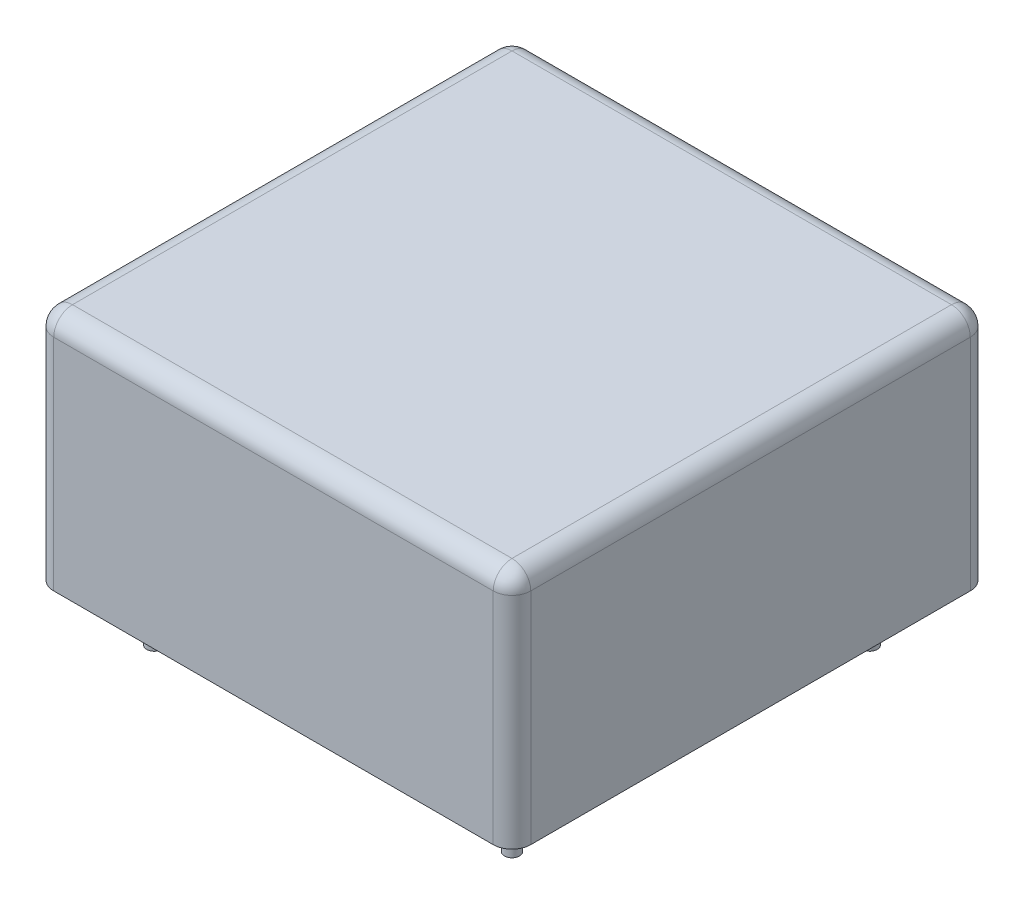
ISO-10303-21;
HEADER;
FILE_DESCRIPTION(('STEP AP214'),'2;1');
FILE_NAME('part.step','',(''),(''),'','','');
FILE_SCHEMA(('AUTOMOTIVE_DESIGN { 1 0 10303 214 1 1 1 1 }'));
ENDSEC;
DATA;
#1=APPLICATION_CONTEXT('core data for automotive mechanical design processes');
#2=APPLICATION_PROTOCOL_DEFINITION('international standard','automotive_design',2000,#1);
#3=PRODUCT_CONTEXT('',#1,'mechanical');
#4=PRODUCT('Part','Part','',(#3));
#5=PRODUCT_RELATED_PRODUCT_CATEGORY('part','',(#4));
#6=PRODUCT_DEFINITION_FORMATION('','',#4);
#7=PRODUCT_DEFINITION_CONTEXT('part definition',#1,'design');
#8=PRODUCT_DEFINITION('design','',#6,#7);
#9=PRODUCT_DEFINITION_SHAPE('','',#8);
#10=(LENGTH_UNIT() NAMED_UNIT(*) SI_UNIT(.MILLI.,.METRE.));
#11=(NAMED_UNIT(*) PLANE_ANGLE_UNIT() SI_UNIT($,.RADIAN.));
#12=(NAMED_UNIT(*) SI_UNIT($,.STERADIAN.) SOLID_ANGLE_UNIT());
#13=UNCERTAINTY_MEASURE_WITH_UNIT(LENGTH_MEASURE(1.E-05),#10,'distance_accuracy_value','');
#14=(GEOMETRIC_REPRESENTATION_CONTEXT(3) GLOBAL_UNCERTAINTY_ASSIGNED_CONTEXT((#13)) GLOBAL_UNIT_ASSIGNED_CONTEXT((#10,
#11,#12)) REPRESENTATION_CONTEXT('',''));
#15=CARTESIAN_POINT('',(0.,0.,0.));
#16=DIRECTION('',(0.,0.,1.));
#17=DIRECTION('',(1.,0.,0.));
#18=AXIS2_PLACEMENT_3D('',#15,#16,#17);
#19=CARTESIAN_POINT('',(0.,-3.,0.));
#20=DIRECTION('',(0.,1.,0.));
#21=DIRECTION('',(0.,0.,1.));
#22=AXIS2_PLACEMENT_3D('',#19,#20,#21);
#23=CYLINDRICAL_SURFACE('',#22,0.4);
#24=CARTESIAN_POINT('',(0.,-3.,0.));
#25=DIRECTION('',(0.,1.,0.));
#26=DIRECTION('',(0.,0.,1.));
#27=AXIS2_PLACEMENT_3D('',#24,#25,#26);
#28=CIRCLE('',#27,0.4);
#29=CARTESIAN_POINT('',(0.,-3.,0.4));
#30=VERTEX_POINT('',#29);
#31=EDGE_CURVE('E168',#30,#30,#28,.T.);
#32=ORIENTED_EDGE('',*,*,#31,.T.);
#33=EDGE_LOOP('',(#32));
#34=FACE_BOUND('',#33,.T.);
#35=CARTESIAN_POINT('',(0.,0.,0.));
#36=DIRECTION('',(0.,1.,0.));
#37=DIRECTION('',(0.,0.,1.));
#38=AXIS2_PLACEMENT_3D('',#35,#36,#37);
#39=CIRCLE('',#38,0.4);
#40=CARTESIAN_POINT('',(0.,0.,0.4));
#41=VERTEX_POINT('',#40);
#42=EDGE_CURVE('E119',#41,#41,#39,.T.);
#43=ORIENTED_EDGE('',*,*,#42,.F.);
#44=EDGE_LOOP('',(#43));
#45=FACE_BOUND('',#44,.T.);
#46=ADVANCED_FACE('F36',(#34,#45),#23,.T.);
#47=CARTESIAN_POINT('',(0.,-3.,0.));
#48=DIRECTION('',(0.,1.,0.));
#49=DIRECTION('',(0.,0.,1.));
#50=AXIS2_PLACEMENT_3D('',#47,#48,#49);
#51=PLANE('',#50);
#52=ORIENTED_EDGE('',*,*,#31,.F.);
#53=EDGE_LOOP('',(#52));
#54=FACE_BOUND('',#53,.T.);
#55=ADVANCED_FACE('F261',(#54),#51,.F.);
#56=CARTESIAN_POINT('',(-2.175,12.7,-2.175));
#57=DIRECTION('',(0.,-1.,0.));
#58=DIRECTION('',(0.,0.,-1.));
#59=AXIS2_PLACEMENT_3D('',#56,#57,#58);
#60=CYLINDRICAL_SURFACE('',#59,1.);
#61=DIRECTION('',(0.,-1.,0.));
#62=VECTOR('',#61,1.);
#63=CARTESIAN_POINT('',(-3.175,12.7,-2.175));
#64=LINE('',#63,#62);
#65=CARTESIAN_POINT('',(-3.175,11.7,-2.175));
#66=VERTEX_POINT('',#65);
#67=CARTESIAN_POINT('',(-3.175,0.,-2.175));
#68=VERTEX_POINT('',#67);
#69=EDGE_CURVE('E112',#66,#68,#64,.T.);
#70=ORIENTED_EDGE('',*,*,#69,.F.);
#71=CARTESIAN_POINT('',(-2.175,11.7,-2.175));
#72=DIRECTION('',(0.,-1.,0.));
#73=DIRECTION('',(0.,0.,-1.));
#74=AXIS2_PLACEMENT_3D('',#71,#72,#73);
#75=CIRCLE('',#74,1.);
#76=CARTESIAN_POINT('',(-2.17499999999999,11.7,-3.175));
#77=VERTEX_POINT('',#76);
#78=EDGE_CURVE('E45',#66,#77,#75,.T.);
#79=ORIENTED_EDGE('',*,*,#78,.T.);
#80=DIRECTION('',(0.,-1.,0.));
#81=VECTOR('',#80,1.);
#82=CARTESIAN_POINT('',(-2.17499999999999,12.7,-3.175));
#83=LINE('',#82,#81);
#84=CARTESIAN_POINT('',(-2.17499999999999,0.,-3.175));
#85=VERTEX_POINT('',#84);
#86=EDGE_CURVE('E132',#77,#85,#83,.T.);
#87=ORIENTED_EDGE('',*,*,#86,.T.);
#88=CARTESIAN_POINT('',(-2.175,0.,-2.175));
#89=DIRECTION('',(0.,1.,0.));
#90=DIRECTION('',(0.,0.,1.));
#91=AXIS2_PLACEMENT_3D('',#88,#89,#90);
#92=CIRCLE('',#91,1.);
#93=EDGE_CURVE('E126',#85,#68,#92,.T.);
#94=ORIENTED_EDGE('',*,*,#93,.T.);
#95=EDGE_LOOP('',(#70,#79,#87,#94));
#96=FACE_BOUND('',#95,.T.);
#97=ADVANCED_FACE('F131',(#96),#60,.T.);
#98=CARTESIAN_POINT('',(-3.175,12.7,-2.175));
#99=DIRECTION('',(1.,0.,0.));
#100=DIRECTION('',(0.,0.,-1.));
#101=AXIS2_PLACEMENT_3D('',#98,#99,#100);
#102=PLANE('',#101);
#103=DIRECTION('',(0.,-1.,0.));
#104=VECTOR('',#103,1.);
#105=CARTESIAN_POINT('',(-3.175,12.7,21.225));
#106=LINE('',#105,#104);
#107=CARTESIAN_POINT('',(-3.175,11.7,21.225));
#108=VERTEX_POINT('',#107);
#109=CARTESIAN_POINT('',(-3.175,0.,21.225));
#110=VERTEX_POINT('',#109);
#111=EDGE_CURVE('E120',#108,#110,#106,.T.);
#112=ORIENTED_EDGE('',*,*,#111,.F.);
#113=DIRECTION('',(0.,0.,1.));
#114=VECTOR('',#113,1.);
#115=CARTESIAN_POINT('',(-3.175,11.7,-2.175));
#116=LINE('',#115,#114);
#117=EDGE_CURVE('E60',#108,#66,#116,.F.);
#118=ORIENTED_EDGE('',*,*,#117,.T.);
#119=ORIENTED_EDGE('',*,*,#69,.T.);
#120=DIRECTION('',(0.,0.,1.));
#121=VECTOR('',#120,1.);
#122=CARTESIAN_POINT('',(-3.175,0.,-2.175));
#123=LINE('',#122,#121);
#124=EDGE_CURVE('E115',#68,#110,#123,.T.);
#125=ORIENTED_EDGE('',*,*,#124,.T.);
#126=EDGE_LOOP('',(#112,#118,#119,#125));
#127=FACE_BOUND('',#126,.T.);
#128=ADVANCED_FACE('F114',(#127),#102,.F.);
#129=CARTESIAN_POINT('',(-2.175,12.7,21.225));
#130=DIRECTION('',(0.,-1.,0.));
#131=DIRECTION('',(0.,0.,-1.));
#132=AXIS2_PLACEMENT_3D('',#129,#130,#131);
#133=CYLINDRICAL_SURFACE('',#132,1.);
#134=DIRECTION('',(0.,-1.,0.));
#135=VECTOR('',#134,1.);
#136=CARTESIAN_POINT('',(-2.17499999999999,12.7,22.225));
#137=LINE('',#136,#135);
#138=CARTESIAN_POINT('',(-2.17499999999999,11.7,22.225));
#139=VERTEX_POINT('',#138);
#140=CARTESIAN_POINT('',(-2.17499999999999,0.,22.225));
#141=VERTEX_POINT('',#140);
#142=EDGE_CURVE('E165',#139,#141,#137,.T.);
#143=ORIENTED_EDGE('',*,*,#142,.F.);
#144=CARTESIAN_POINT('',(-2.175,11.7,21.225));
#145=DIRECTION('',(0.,-1.,0.));
#146=DIRECTION('',(0.,0.,-1.));
#147=AXIS2_PLACEMENT_3D('',#144,#145,#146);
#148=CIRCLE('',#147,1.);
#149=EDGE_CURVE('E191',#139,#108,#148,.T.);
#150=ORIENTED_EDGE('',*,*,#149,.T.);
#151=ORIENTED_EDGE('',*,*,#111,.T.);
#152=CARTESIAN_POINT('',(-2.175,0.,21.225));
#153=DIRECTION('',(0.,1.,0.));
#154=DIRECTION('',(0.,0.,1.));
#155=AXIS2_PLACEMENT_3D('',#152,#153,#154);
#156=CIRCLE('',#155,1.);
#157=EDGE_CURVE('E129',#110,#141,#156,.T.);
#158=ORIENTED_EDGE('',*,*,#157,.T.);
#159=EDGE_LOOP('',(#143,#150,#151,#158));
#160=FACE_BOUND('',#159,.T.);
#161=ADVANCED_FACE('F338',(#160),#133,.T.);
#162=CARTESIAN_POINT('',(-2.17499999999999,12.7,22.225));
#163=DIRECTION('',(0.,0.,-1.));
#164=DIRECTION('',(-1.,0.,0.));
#165=AXIS2_PLACEMENT_3D('',#162,#163,#164);
#166=PLANE('',#165);
#167=DIRECTION('',(0.,-1.,0.));
#168=VECTOR('',#167,1.);
#169=CARTESIAN_POINT('',(21.225,12.7,22.225));
#170=LINE('',#169,#168);
#171=CARTESIAN_POINT('',(21.225,11.7,22.225));
#172=VERTEX_POINT('',#171);
#173=CARTESIAN_POINT('',(21.225,0.,22.225));
#174=VERTEX_POINT('',#173);
#175=EDGE_CURVE('E163',#172,#174,#170,.T.);
#176=ORIENTED_EDGE('',*,*,#175,.F.);
#177=DIRECTION('',(1.,0.,0.));
#178=VECTOR('',#177,1.);
#179=CARTESIAN_POINT('',(-2.17499999999999,11.7,22.225));
#180=LINE('',#179,#178);
#181=EDGE_CURVE('E189',#172,#139,#180,.F.);
#182=ORIENTED_EDGE('',*,*,#181,.T.);
#183=ORIENTED_EDGE('',*,*,#142,.T.);
#184=DIRECTION('',(1.,0.,0.));
#185=VECTOR('',#184,1.);
#186=CARTESIAN_POINT('',(-2.17499999999999,0.,22.225));
#187=LINE('',#186,#185);
#188=EDGE_CURVE('E142',#141,#174,#187,.T.);
#189=ORIENTED_EDGE('',*,*,#188,.T.);
#190=EDGE_LOOP('',(#176,#182,#183,#189));
#191=FACE_BOUND('',#190,.T.);
#192=ADVANCED_FACE('F336',(#191),#166,.F.);
#193=CARTESIAN_POINT('',(21.225,12.7,21.225));
#194=DIRECTION('',(0.,-1.,0.));
#195=DIRECTION('',(0.,0.,-1.));
#196=AXIS2_PLACEMENT_3D('',#193,#194,#195);
#197=CYLINDRICAL_SURFACE('',#196,1.);
#198=DIRECTION('',(0.,-1.,0.));
#199=VECTOR('',#198,1.);
#200=CARTESIAN_POINT('',(22.225,12.7,21.225));
#201=LINE('',#200,#199);
#202=CARTESIAN_POINT('',(22.225,11.7,21.225));
#203=VERTEX_POINT('',#202);
#204=CARTESIAN_POINT('',(22.225,0.,21.225));
#205=VERTEX_POINT('',#204);
#206=EDGE_CURVE('E161',#203,#205,#201,.T.);
#207=ORIENTED_EDGE('',*,*,#206,.F.);
#208=CARTESIAN_POINT('',(21.225,11.7,21.225));
#209=DIRECTION('',(0.,-1.,0.));
#210=DIRECTION('',(0.,0.,-1.));
#211=AXIS2_PLACEMENT_3D('',#208,#209,#210);
#212=CIRCLE('',#211,1.);
#213=EDGE_CURVE('E187',#203,#172,#212,.T.);
#214=ORIENTED_EDGE('',*,*,#213,.T.);
#215=ORIENTED_EDGE('',*,*,#175,.T.);
#216=CARTESIAN_POINT('',(21.225,0.,21.225));
#217=DIRECTION('',(0.,1.,0.));
#218=DIRECTION('',(0.,0.,1.));
#219=AXIS2_PLACEMENT_3D('',#216,#217,#218);
#220=CIRCLE('',#219,1.);
#221=EDGE_CURVE('E145',#174,#205,#220,.T.);
#222=ORIENTED_EDGE('',*,*,#221,.T.);
#223=EDGE_LOOP('',(#207,#214,#215,#222));
#224=FACE_BOUND('',#223,.T.);
#225=ADVANCED_FACE('F329',(#224),#197,.T.);
#226=CARTESIAN_POINT('',(22.225,12.7,-2.175));
#227=DIRECTION('',(-1.,0.,0.));
#228=DIRECTION('',(0.,0.,1.));
#229=AXIS2_PLACEMENT_3D('',#226,#227,#228);
#230=PLANE('',#229);
#231=DIRECTION('',(0.,-1.,0.));
#232=VECTOR('',#231,1.);
#233=CARTESIAN_POINT('',(22.225,12.7,-2.175));
#234=LINE('',#233,#232);
#235=CARTESIAN_POINT('',(22.225,11.7,-2.175));
#236=VERTEX_POINT('',#235);
#237=CARTESIAN_POINT('',(22.225,0.,-2.175));
#238=VERTEX_POINT('',#237);
#239=EDGE_CURVE('E159',#236,#238,#234,.T.);
#240=ORIENTED_EDGE('',*,*,#239,.F.);
#241=DIRECTION('',(0.,0.,-1.));
#242=VECTOR('',#241,1.);
#243=CARTESIAN_POINT('',(22.225,11.7,21.225));
#244=LINE('',#243,#242);
#245=EDGE_CURVE('E185',#236,#203,#244,.F.);
#246=ORIENTED_EDGE('',*,*,#245,.T.);
#247=ORIENTED_EDGE('',*,*,#206,.T.);
#248=DIRECTION('',(0.,0.,-1.));
#249=VECTOR('',#248,1.);
#250=CARTESIAN_POINT('',(22.225,0.,-2.175));
#251=LINE('',#250,#249);
#252=EDGE_CURVE('E148',#205,#238,#251,.T.);
#253=ORIENTED_EDGE('',*,*,#252,.T.);
#254=EDGE_LOOP('',(#240,#246,#247,#253));
#255=FACE_BOUND('',#254,.T.);
#256=ADVANCED_FACE('F326',(#255),#230,.F.);
#257=CARTESIAN_POINT('',(21.225,12.7,-2.175));
#258=DIRECTION('',(0.,-1.,0.));
#259=DIRECTION('',(0.,0.,-1.));
#260=AXIS2_PLACEMENT_3D('',#257,#258,#259);
#261=CYLINDRICAL_SURFACE('',#260,1.);
#262=DIRECTION('',(0.,-1.,0.));
#263=VECTOR('',#262,1.);
#264=CARTESIAN_POINT('',(21.225,12.7,-3.175));
#265=LINE('',#264,#263);
#266=CARTESIAN_POINT('',(21.225,11.7,-3.175));
#267=VERTEX_POINT('',#266);
#268=CARTESIAN_POINT('',(21.225,0.,-3.175));
#269=VERTEX_POINT('',#268);
#270=EDGE_CURVE('E157',#267,#269,#265,.T.);
#271=ORIENTED_EDGE('',*,*,#270,.F.);
#272=CARTESIAN_POINT('',(21.225,11.7,-2.175));
#273=DIRECTION('',(0.,-1.,0.));
#274=DIRECTION('',(0.,0.,-1.));
#275=AXIS2_PLACEMENT_3D('',#272,#273,#274);
#276=CIRCLE('',#275,1.);
#277=EDGE_CURVE('E171',#267,#236,#276,.T.);
#278=ORIENTED_EDGE('',*,*,#277,.T.);
#279=ORIENTED_EDGE('',*,*,#239,.T.);
#280=CARTESIAN_POINT('',(21.225,0.,-2.175));
#281=DIRECTION('',(0.,1.,0.));
#282=DIRECTION('',(0.,0.,1.));
#283=AXIS2_PLACEMENT_3D('',#280,#281,#282);
#284=CIRCLE('',#283,1.);
#285=EDGE_CURVE('E151',#238,#269,#284,.T.);
#286=ORIENTED_EDGE('',*,*,#285,.T.);
#287=EDGE_LOOP('',(#271,#278,#279,#286));
#288=FACE_BOUND('',#287,.T.);
#289=ADVANCED_FACE('F317',(#288),#261,.T.);
#290=CARTESIAN_POINT('',(-2.17499999999999,12.7,-3.175));
#291=DIRECTION('',(0.,0.,1.));
#292=DIRECTION('',(1.,0.,0.));
#293=AXIS2_PLACEMENT_3D('',#290,#291,#292);
#294=PLANE('',#293);
#295=ORIENTED_EDGE('',*,*,#86,.F.);
#296=DIRECTION('',(-1.,0.,0.));
#297=VECTOR('',#296,1.);
#298=CARTESIAN_POINT('',(21.225,11.7,-3.175));
#299=LINE('',#298,#297);
#300=EDGE_CURVE('E11',#77,#267,#299,.F.);
#301=ORIENTED_EDGE('',*,*,#300,.T.);
#302=ORIENTED_EDGE('',*,*,#270,.T.);
#303=DIRECTION('',(-1.,0.,0.));
#304=VECTOR('',#303,1.);
#305=CARTESIAN_POINT('',(-2.17499999999999,0.,-3.175));
#306=LINE('',#305,#304);
#307=EDGE_CURVE('E154',#269,#85,#306,.T.);
#308=ORIENTED_EDGE('',*,*,#307,.T.);
#309=EDGE_LOOP('',(#295,#301,#302,#308));
#310=FACE_BOUND('',#309,.T.);
#311=ADVANCED_FACE('F314',(#310),#294,.F.);
#312=CARTESIAN_POINT('',(-2.175,12.7,-2.175));
#313=DIRECTION('',(0.,1.,0.));
#314=DIRECTION('',(0.,0.,1.));
#315=AXIS2_PLACEMENT_3D('',#312,#313,#314);
#316=PLANE('',#315);
#317=DIRECTION('',(1.,0.,0.));
#318=VECTOR('',#317,1.);
#319=CARTESIAN_POINT('',(21.225,12.7,21.225));
#320=LINE('',#319,#318);
#321=CARTESIAN_POINT('',(-2.175,12.7,21.225));
#322=VERTEX_POINT('',#321);
#323=CARTESIAN_POINT('',(21.225,12.7,21.225));
#324=VERTEX_POINT('',#323);
#325=EDGE_CURVE('E180',#322,#324,#320,.T.);
#326=ORIENTED_EDGE('',*,*,#325,.T.);
#327=DIRECTION('',(0.,0.,-1.));
#328=VECTOR('',#327,1.);
#329=CARTESIAN_POINT('',(21.225,12.7,-2.17499999999999));
#330=LINE('',#329,#328);
#331=CARTESIAN_POINT('',(21.225,12.7,-2.175));
#332=VERTEX_POINT('',#331);
#333=EDGE_CURVE('E182',#324,#332,#330,.T.);
#334=ORIENTED_EDGE('',*,*,#333,.T.);
#335=DIRECTION('',(-1.,0.,0.));
#336=VECTOR('',#335,1.);
#337=CARTESIAN_POINT('',(-2.17499999999999,12.7,-2.175));
#338=LINE('',#337,#336);
#339=CARTESIAN_POINT('',(-2.175,12.7,-2.175));
#340=VERTEX_POINT('',#339);
#341=EDGE_CURVE('E176',#332,#340,#338,.T.);
#342=ORIENTED_EDGE('',*,*,#341,.T.);
#343=DIRECTION('',(0.,0.,1.));
#344=VECTOR('',#343,1.);
#345=CARTESIAN_POINT('',(-2.175,12.7,21.225));
#346=LINE('',#345,#344);
#347=EDGE_CURVE('E178',#340,#322,#346,.T.);
#348=ORIENTED_EDGE('',*,*,#347,.T.);
#349=EDGE_LOOP('',(#326,#334,#342,#348));
#350=FACE_BOUND('',#349,.T.);
#351=ADVANCED_FACE('F400',(#350),#316,.T.);
#352=CARTESIAN_POINT('',(-2.175,0.,-2.175));
#353=DIRECTION('',(0.,1.,0.));
#354=DIRECTION('',(0.,0.,1.));
#355=AXIS2_PLACEMENT_3D('',#352,#353,#354);
#356=PLANE('',#355);
#357=CARTESIAN_POINT('',(19.05,0.,0.));
#358=DIRECTION('',(0.,1.,0.));
#359=DIRECTION('',(0.,0.,1.));
#360=AXIS2_PLACEMENT_3D('',#357,#358,#359);
#361=CIRCLE('',#360,0.400000000000001);
#362=CARTESIAN_POINT('',(19.05,0.,0.400000000000001));
#363=VERTEX_POINT('',#362);
#364=EDGE_CURVE('E217',#363,#363,#361,.T.);
#365=ORIENTED_EDGE('',*,*,#364,.T.);
#366=EDGE_LOOP('',(#365));
#367=FACE_BOUND('',#366,.T.);
#368=CARTESIAN_POINT('',(19.05,0.,19.05));
#369=DIRECTION('',(0.,1.,0.));
#370=DIRECTION('',(0.,0.,1.));
#371=AXIS2_PLACEMENT_3D('',#368,#369,#370);
#372=CIRCLE('',#371,0.400000000000002);
#373=CARTESIAN_POINT('',(19.05,0.,19.45));
#374=VERTEX_POINT('',#373);
#375=EDGE_CURVE('E227',#374,#374,#372,.T.);
#376=ORIENTED_EDGE('',*,*,#375,.T.);
#377=EDGE_LOOP('',(#376));
#378=FACE_BOUND('',#377,.T.);
#379=CARTESIAN_POINT('',(0.,0.,19.05));
#380=DIRECTION('',(0.,1.,0.));
#381=DIRECTION('',(0.,0.,1.));
#382=AXIS2_PLACEMENT_3D('',#379,#380,#381);
#383=CIRCLE('',#382,0.4);
#384=CARTESIAN_POINT('',(0.,0.,19.45));
#385=VERTEX_POINT('',#384);
#386=EDGE_CURVE('E233',#385,#385,#383,.T.);
#387=ORIENTED_EDGE('',*,*,#386,.T.);
#388=EDGE_LOOP('',(#387));
#389=FACE_BOUND('',#388,.T.);
#390=CARTESIAN_POINT('',(9.525,0.,0.));
#391=DIRECTION('',(0.,1.,0.));
#392=DIRECTION('',(0.,0.,1.));
#393=AXIS2_PLACEMENT_3D('',#390,#391,#392);
#394=CIRCLE('',#393,0.400000000000001);
#395=CARTESIAN_POINT('',(9.525,0.,0.400000000000001));
#396=VERTEX_POINT('',#395);
#397=EDGE_CURVE('E137',#396,#396,#394,.T.);
#398=ORIENTED_EDGE('',*,*,#397,.T.);
#399=EDGE_LOOP('',(#398));
#400=FACE_BOUND('',#399,.T.);
#401=ORIENTED_EDGE('',*,*,#42,.T.);
#402=EDGE_LOOP('',(#401));
#403=FACE_BOUND('',#402,.T.);
#404=ORIENTED_EDGE('',*,*,#93,.F.);
#405=ORIENTED_EDGE('',*,*,#307,.F.);
#406=ORIENTED_EDGE('',*,*,#285,.F.);
#407=ORIENTED_EDGE('',*,*,#252,.F.);
#408=ORIENTED_EDGE('',*,*,#221,.F.);
#409=ORIENTED_EDGE('',*,*,#188,.F.);
#410=ORIENTED_EDGE('',*,*,#157,.F.);
#411=ORIENTED_EDGE('',*,*,#124,.F.);
#412=EDGE_LOOP('',(#404,#405,#406,#407,#408,#409,#410,#411));
#413=FACE_BOUND('',#412,.T.);
#414=ADVANCED_FACE('F124',(#367,#378,#389,#400,#403,#413),#356,.F.);
#415=CARTESIAN_POINT('',(9.525,-3.,0.));
#416=DIRECTION('',(0.,1.,0.));
#417=DIRECTION('',(0.,0.,1.));
#418=AXIS2_PLACEMENT_3D('',#415,#416,#417);
#419=CYLINDRICAL_SURFACE('',#418,0.400000000000001);
#420=CARTESIAN_POINT('',(9.525,-3.,0.));
#421=DIRECTION('',(0.,1.,0.));
#422=DIRECTION('',(0.,0.,1.));
#423=AXIS2_PLACEMENT_3D('',#420,#421,#422);
#424=CIRCLE('',#423,0.400000000000001);
#425=CARTESIAN_POINT('',(9.525,-3.,0.400000000000001));
#426=VERTEX_POINT('',#425);
#427=EDGE_CURVE('E134',#426,#426,#424,.T.);
#428=ORIENTED_EDGE('',*,*,#427,.T.);
#429=EDGE_LOOP('',(#428));
#430=FACE_BOUND('',#429,.T.);
#431=ORIENTED_EDGE('',*,*,#397,.F.);
#432=EDGE_LOOP('',(#431));
#433=FACE_BOUND('',#432,.T.);
#434=ADVANCED_FACE('F257',(#430,#433),#419,.T.);
#435=CARTESIAN_POINT('',(9.525,-3.,0.));
#436=DIRECTION('',(0.,1.,0.));
#437=DIRECTION('',(0.,0.,1.));
#438=AXIS2_PLACEMENT_3D('',#435,#436,#437);
#439=PLANE('',#438);
#440=ORIENTED_EDGE('',*,*,#427,.F.);
#441=EDGE_LOOP('',(#440));
#442=FACE_BOUND('',#441,.T.);
#443=ADVANCED_FACE('F247',(#442),#439,.F.);
#444=CARTESIAN_POINT('',(0.,-3.,19.05));
#445=DIRECTION('',(0.,1.,0.));
#446=DIRECTION('',(0.,0.,1.));
#447=AXIS2_PLACEMENT_3D('',#444,#445,#446);
#448=CYLINDRICAL_SURFACE('',#447,0.4);
#449=CARTESIAN_POINT('',(0.,-3.,19.05));
#450=DIRECTION('',(0.,1.,0.));
#451=DIRECTION('',(0.,0.,1.));
#452=AXIS2_PLACEMENT_3D('',#449,#450,#451);
#453=CIRCLE('',#452,0.4);
#454=CARTESIAN_POINT('',(0.,-3.,19.45));
#455=VERTEX_POINT('',#454);
#456=EDGE_CURVE('E236',#455,#455,#453,.T.);
#457=ORIENTED_EDGE('',*,*,#456,.T.);
#458=EDGE_LOOP('',(#457));
#459=FACE_BOUND('',#458,.T.);
#460=ORIENTED_EDGE('',*,*,#386,.F.);
#461=EDGE_LOOP('',(#460));
#462=FACE_BOUND('',#461,.T.);
#463=ADVANCED_FACE('F244',(#459,#462),#448,.T.);
#464=CARTESIAN_POINT('',(0.,-3.,19.05));
#465=DIRECTION('',(0.,1.,0.));
#466=DIRECTION('',(0.,0.,1.));
#467=AXIS2_PLACEMENT_3D('',#464,#465,#466);
#468=PLANE('',#467);
#469=ORIENTED_EDGE('',*,*,#456,.F.);
#470=EDGE_LOOP('',(#469));
#471=FACE_BOUND('',#470,.T.);
#472=ADVANCED_FACE('F246',(#471),#468,.F.);
#473=CARTESIAN_POINT('',(19.05,-3.,19.05));
#474=DIRECTION('',(0.,1.,0.));
#475=DIRECTION('',(0.,0.,1.));
#476=AXIS2_PLACEMENT_3D('',#473,#474,#475);
#477=CYLINDRICAL_SURFACE('',#476,0.400000000000002);
#478=CARTESIAN_POINT('',(19.05,-3.,19.05));
#479=DIRECTION('',(0.,1.,0.));
#480=DIRECTION('',(0.,0.,1.));
#481=AXIS2_PLACEMENT_3D('',#478,#479,#480);
#482=CIRCLE('',#481,0.400000000000002);
#483=CARTESIAN_POINT('',(19.05,-3.,19.45));
#484=VERTEX_POINT('',#483);
#485=EDGE_CURVE('E230',#484,#484,#482,.T.);
#486=ORIENTED_EDGE('',*,*,#485,.T.);
#487=EDGE_LOOP('',(#486));
#488=FACE_BOUND('',#487,.T.);
#489=ORIENTED_EDGE('',*,*,#375,.F.);
#490=EDGE_LOOP('',(#489));
#491=FACE_BOUND('',#490,.T.);
#492=ADVANCED_FACE('F254',(#488,#491),#477,.T.);
#493=CARTESIAN_POINT('',(19.05,-3.,19.05));
#494=DIRECTION('',(0.,1.,0.));
#495=DIRECTION('',(0.,0.,1.));
#496=AXIS2_PLACEMENT_3D('',#493,#494,#495);
#497=PLANE('',#496);
#498=ORIENTED_EDGE('',*,*,#485,.F.);
#499=EDGE_LOOP('',(#498));
#500=FACE_BOUND('',#499,.T.);
#501=ADVANCED_FACE('F508',(#500),#497,.F.);
#502=CARTESIAN_POINT('',(19.05,-3.,0.));
#503=DIRECTION('',(0.,1.,0.));
#504=DIRECTION('',(0.,0.,1.));
#505=AXIS2_PLACEMENT_3D('',#502,#503,#504);
#506=CYLINDRICAL_SURFACE('',#505,0.400000000000001);
#507=CARTESIAN_POINT('',(19.05,-3.,0.));
#508=DIRECTION('',(0.,1.,0.));
#509=DIRECTION('',(0.,0.,1.));
#510=AXIS2_PLACEMENT_3D('',#507,#508,#509);
#511=CIRCLE('',#510,0.400000000000001);
#512=CARTESIAN_POINT('',(19.05,-3.,0.400000000000001));
#513=VERTEX_POINT('',#512);
#514=EDGE_CURVE('E222',#513,#513,#511,.T.);
#515=ORIENTED_EDGE('',*,*,#514,.T.);
#516=EDGE_LOOP('',(#515));
#517=FACE_BOUND('',#516,.T.);
#518=ORIENTED_EDGE('',*,*,#364,.F.);
#519=EDGE_LOOP('',(#518));
#520=FACE_BOUND('',#519,.T.);
#521=ADVANCED_FACE('F304',(#517,#520),#506,.T.);
#522=CARTESIAN_POINT('',(19.05,-3.,0.));
#523=DIRECTION('',(0.,1.,0.));
#524=DIRECTION('',(0.,0.,1.));
#525=AXIS2_PLACEMENT_3D('',#522,#523,#524);
#526=PLANE('',#525);
#527=ORIENTED_EDGE('',*,*,#514,.F.);
#528=EDGE_LOOP('',(#527));
#529=FACE_BOUND('',#528,.T.);
#530=ADVANCED_FACE('F299',(#529),#526,.F.);
#531=CARTESIAN_POINT('',(-2.175,11.7,21.225));
#532=DIRECTION('',(0.,1.,0.));
#533=DIRECTION('',(0.,0.,1.));
#534=AXIS2_PLACEMENT_3D('',#531,#532,#533);
#535=SPHERICAL_SURFACE('',#534,1.);
#536=CARTESIAN_POINT('',(-2.175,11.7,21.225));
#537=DIRECTION('',(0.,0.,-1.));
#538=DIRECTION('',(-1.,0.,0.));
#539=AXIS2_PLACEMENT_3D('',#536,#537,#538);
#540=CIRCLE('',#539,1.);
#541=EDGE_CURVE('E210',#108,#322,#540,.T.);
#542=ORIENTED_EDGE('',*,*,#541,.F.);
#543=ORIENTED_EDGE('',*,*,#149,.F.);
#544=CARTESIAN_POINT('',(-2.175,11.7,21.225));
#545=DIRECTION('',(1.,0.,0.));
#546=DIRECTION('',(0.,0.,-1.));
#547=AXIS2_PLACEMENT_3D('',#544,#545,#546);
#548=CIRCLE('',#547,1.);
#549=EDGE_CURVE('E40',#322,#139,#548,.T.);
#550=ORIENTED_EDGE('',*,*,#549,.F.);
#551=EDGE_LOOP('',(#542,#543,#550));
#552=FACE_BOUND('',#551,.T.);
#553=ADVANCED_FACE('F38',(#552),#535,.T.);
#554=CARTESIAN_POINT('',(-2.175,11.7,21.225));
#555=DIRECTION('',(-1.,0.,0.));
#556=DIRECTION('',(0.,0.,1.));
#557=AXIS2_PLACEMENT_3D('',#554,#555,#556);
#558=CYLINDRICAL_SURFACE('',#557,1.);
#559=ORIENTED_EDGE('',*,*,#549,.T.);
#560=ORIENTED_EDGE('',*,*,#181,.F.);
#561=CARTESIAN_POINT('',(21.225,11.7,21.225));
#562=DIRECTION('',(1.,0.,0.));
#563=DIRECTION('',(0.,0.,-1.));
#564=AXIS2_PLACEMENT_3D('',#561,#562,#563);
#565=CIRCLE('',#564,1.);
#566=EDGE_CURVE('E208',#324,#172,#565,.T.);
#567=ORIENTED_EDGE('',*,*,#566,.F.);
#568=ORIENTED_EDGE('',*,*,#325,.F.);
#569=EDGE_LOOP('',(#559,#560,#567,#568));
#570=FACE_BOUND('',#569,.T.);
#571=ADVANCED_FACE('F294',(#570),#558,.T.);
#572=CARTESIAN_POINT('',(-2.175,11.7,-2.175));
#573=DIRECTION('',(0.,0.,-1.));
#574=DIRECTION('',(-1.,0.,0.));
#575=AXIS2_PLACEMENT_3D('',#572,#573,#574);
#576=CYLINDRICAL_SURFACE('',#575,1.);
#577=ORIENTED_EDGE('',*,*,#541,.T.);
#578=ORIENTED_EDGE('',*,*,#347,.F.);
#579=CARTESIAN_POINT('',(-2.175,11.7,-2.175));
#580=DIRECTION('',(0.,0.,-1.));
#581=DIRECTION('',(-1.,0.,0.));
#582=AXIS2_PLACEMENT_3D('',#579,#580,#581);
#583=CIRCLE('',#582,1.);
#584=EDGE_CURVE('E205',#66,#340,#583,.T.);
#585=ORIENTED_EDGE('',*,*,#584,.F.);
#586=ORIENTED_EDGE('',*,*,#117,.F.);
#587=EDGE_LOOP('',(#577,#578,#585,#586));
#588=FACE_BOUND('',#587,.T.);
#589=ADVANCED_FACE('F291',(#588),#576,.T.);
#590=CARTESIAN_POINT('',(21.225,11.7,21.225));
#591=DIRECTION('',(0.,1.,0.));
#592=DIRECTION('',(0.,0.,1.));
#593=AXIS2_PLACEMENT_3D('',#590,#591,#592);
#594=SPHERICAL_SURFACE('',#593,1.);
#595=ORIENTED_EDGE('',*,*,#566,.T.);
#596=ORIENTED_EDGE('',*,*,#213,.F.);
#597=CARTESIAN_POINT('',(21.225,11.7,21.225));
#598=DIRECTION('',(0.,0.,-1.));
#599=DIRECTION('',(-1.,0.,0.));
#600=AXIS2_PLACEMENT_3D('',#597,#598,#599);
#601=CIRCLE('',#600,1.);
#602=EDGE_CURVE('E202',#324,#203,#601,.T.);
#603=ORIENTED_EDGE('',*,*,#602,.F.);
#604=EDGE_LOOP('',(#595,#596,#603));
#605=FACE_BOUND('',#604,.T.);
#606=ADVANCED_FACE('F287',(#605),#594,.T.);
#607=CARTESIAN_POINT('',(-2.175,11.7,-2.175));
#608=DIRECTION('',(0.,1.,0.));
#609=DIRECTION('',(0.,0.,1.));
#610=AXIS2_PLACEMENT_3D('',#607,#608,#609);
#611=SPHERICAL_SURFACE('',#610,1.);
#612=ORIENTED_EDGE('',*,*,#78,.F.);
#613=ORIENTED_EDGE('',*,*,#584,.T.);
#614=CARTESIAN_POINT('',(-2.175,11.7,-2.175));
#615=DIRECTION('',(1.,0.,0.));
#616=DIRECTION('',(0.,0.,-1.));
#617=AXIS2_PLACEMENT_3D('',#614,#615,#616);
#618=CIRCLE('',#617,1.);
#619=EDGE_CURVE('E199',#77,#340,#618,.T.);
#620=ORIENTED_EDGE('',*,*,#619,.F.);
#621=EDGE_LOOP('',(#612,#613,#620));
#622=FACE_BOUND('',#621,.T.);
#623=ADVANCED_FACE('F283',(#622),#611,.T.);
#624=CARTESIAN_POINT('',(21.225,11.7,-2.17500000000001));
#625=DIRECTION('',(0.,0.,1.));
#626=DIRECTION('',(1.,0.,0.));
#627=AXIS2_PLACEMENT_3D('',#624,#625,#626);
#628=CYLINDRICAL_SURFACE('',#627,1.);
#629=ORIENTED_EDGE('',*,*,#602,.T.);
#630=ORIENTED_EDGE('',*,*,#245,.F.);
#631=CARTESIAN_POINT('',(21.225,11.7,-2.175));
#632=DIRECTION('',(0.,0.,-1.));
#633=DIRECTION('',(-1.,0.,0.));
#634=AXIS2_PLACEMENT_3D('',#631,#632,#633);
#635=CIRCLE('',#634,1.);
#636=EDGE_CURVE('E197',#332,#236,#635,.T.);
#637=ORIENTED_EDGE('',*,*,#636,.F.);
#638=ORIENTED_EDGE('',*,*,#333,.F.);
#639=EDGE_LOOP('',(#629,#630,#637,#638));
#640=FACE_BOUND('',#639,.T.);
#641=ADVANCED_FACE('F279',(#640),#628,.T.);
#642=CARTESIAN_POINT('',(-2.175,11.7,-2.175));
#643=DIRECTION('',(1.,0.,0.));
#644=DIRECTION('',(0.,0.,-1.));
#645=AXIS2_PLACEMENT_3D('',#642,#643,#644);
#646=CYLINDRICAL_SURFACE('',#645,1.);
#647=ORIENTED_EDGE('',*,*,#619,.T.);
#648=ORIENTED_EDGE('',*,*,#341,.F.);
#649=CARTESIAN_POINT('',(21.225,11.7,-2.175));
#650=DIRECTION('',(1.,0.,0.));
#651=DIRECTION('',(0.,1.,0.));
#652=AXIS2_PLACEMENT_3D('',#649,#650,#651);
#653=CIRCLE('',#652,1.);
#654=EDGE_CURVE('E195',#267,#332,#653,.T.);
#655=ORIENTED_EDGE('',*,*,#654,.F.);
#656=ORIENTED_EDGE('',*,*,#300,.F.);
#657=EDGE_LOOP('',(#647,#648,#655,#656));
#658=FACE_BOUND('',#657,.T.);
#659=ADVANCED_FACE('F275',(#658),#646,.T.);
#660=CARTESIAN_POINT('',(21.225,11.7,-2.175));
#661=DIRECTION('',(0.,1.,0.));
#662=DIRECTION('',(0.,0.,1.));
#663=AXIS2_PLACEMENT_3D('',#660,#661,#662);
#664=SPHERICAL_SURFACE('',#663,1.);
#665=ORIENTED_EDGE('',*,*,#636,.T.);
#666=ORIENTED_EDGE('',*,*,#277,.F.);
#667=ORIENTED_EDGE('',*,*,#654,.T.);
#668=EDGE_LOOP('',(#665,#666,#667));
#669=FACE_BOUND('',#668,.T.);
#670=ADVANCED_FACE('F272',(#669),#664,.T.);
#671=CLOSED_SHELL('',(#46,#55,#97,#128,#161,#192,#225,#256,#289,#311,#351,#414,#434,#443,#463,
#472,#492,#501,#521,#530,#553,#571,#589,#606,#623,#641,#659,#670));
#672=MANIFOLD_SOLID_BREP('B2',#671);
#673=ADVANCED_BREP_SHAPE_REPRESENTATION('',(#18,#672),#14);
#674=SHAPE_DEFINITION_REPRESENTATION(#9,#673);
ENDSEC;
END-ISO-10303-21;
